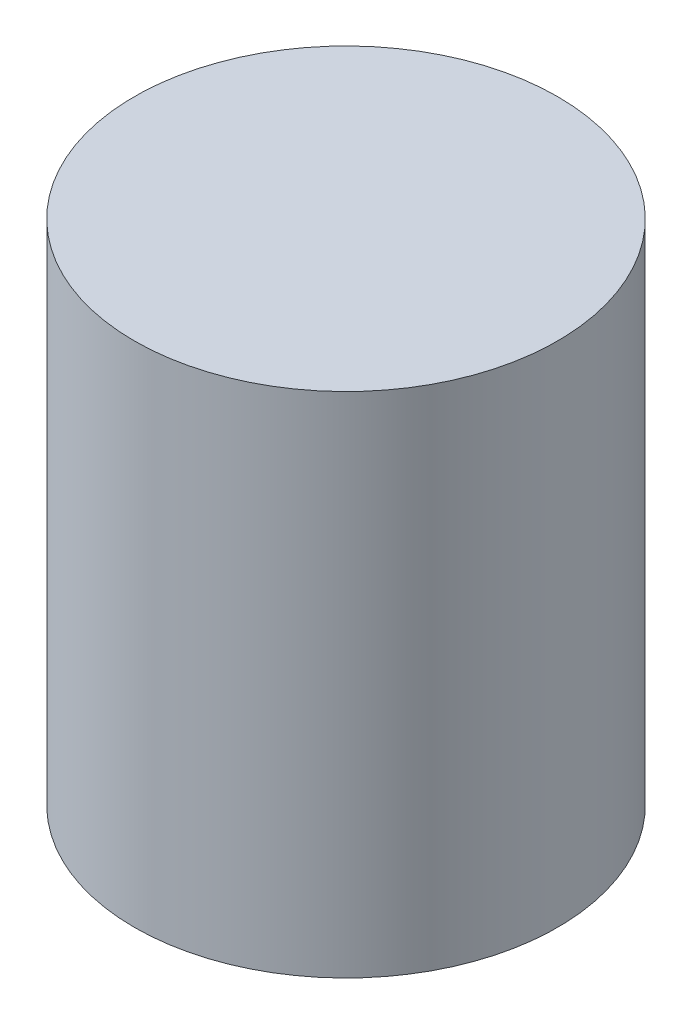
ISO-10303-21;
HEADER;
FILE_DESCRIPTION(('STEP AP214'),'2;1');
FILE_NAME('part.step','',(''),(''),'','','');
FILE_SCHEMA(('AUTOMOTIVE_DESIGN { 1 0 10303 214 1 1 1 1 }'));
ENDSEC;
DATA;
#1=APPLICATION_CONTEXT('core data for automotive mechanical design processes');
#2=APPLICATION_PROTOCOL_DEFINITION('international standard','automotive_design',2000,#1);
#3=PRODUCT_CONTEXT('',#1,'mechanical');
#4=PRODUCT('Part','Part','',(#3));
#5=PRODUCT_RELATED_PRODUCT_CATEGORY('part','',(#4));
#6=PRODUCT_DEFINITION_FORMATION('','',#4);
#7=PRODUCT_DEFINITION_CONTEXT('part definition',#1,'design');
#8=PRODUCT_DEFINITION('design','',#6,#7);
#9=PRODUCT_DEFINITION_SHAPE('','',#8);
#10=(LENGTH_UNIT() NAMED_UNIT(*) SI_UNIT(.MILLI.,.METRE.));
#11=(NAMED_UNIT(*) PLANE_ANGLE_UNIT() SI_UNIT($,.RADIAN.));
#12=(NAMED_UNIT(*) SI_UNIT($,.STERADIAN.) SOLID_ANGLE_UNIT());
#13=UNCERTAINTY_MEASURE_WITH_UNIT(LENGTH_MEASURE(1.E-05),#10,'distance_accuracy_value','');
#14=(GEOMETRIC_REPRESENTATION_CONTEXT(3) GLOBAL_UNCERTAINTY_ASSIGNED_CONTEXT((#13)) GLOBAL_UNIT_ASSIGNED_CONTEXT((#10,
#11,#12)) REPRESENTATION_CONTEXT('',''));
#15=CARTESIAN_POINT('',(0.,0.,0.));
#16=DIRECTION('',(0.,0.,1.));
#17=DIRECTION('',(1.,0.,0.));
#18=AXIS2_PLACEMENT_3D('',#15,#16,#17);
#19=CARTESIAN_POINT('',(0.,60.,0.));
#20=DIRECTION('',(0.,-1.,0.));
#21=DIRECTION('',(0.,0.,-1.));
#22=AXIS2_PLACEMENT_3D('',#19,#20,#21);
#23=CYLINDRICAL_SURFACE('',#22,25.);
#24=CARTESIAN_POINT('',(0.,60.,0.));
#25=DIRECTION('',(0.,1.,0.));
#26=DIRECTION('',(0.,0.,1.));
#27=AXIS2_PLACEMENT_3D('',#24,#25,#26);
#28=CIRCLE('',#27,25.);
#29=CARTESIAN_POINT('',(0.,60.,25.));
#30=VERTEX_POINT('',#29);
#31=EDGE_CURVE('E44',#30,#30,#28,.T.);
#32=ORIENTED_EDGE('',*,*,#31,.F.);
#33=EDGE_LOOP('',(#32));
#34=FACE_BOUND('',#33,.T.);
#35=CARTESIAN_POINT('',(0.,0.,0.));
#36=DIRECTION('',(0.,1.,0.));
#37=DIRECTION('',(0.,0.,1.));
#38=AXIS2_PLACEMENT_3D('',#35,#36,#37);
#39=CIRCLE('',#38,25.);
#40=CARTESIAN_POINT('',(0.,0.,25.));
#41=VERTEX_POINT('',#40);
#42=EDGE_CURVE('E48',#41,#41,#39,.T.);
#43=ORIENTED_EDGE('',*,*,#42,.T.);
#44=EDGE_LOOP('',(#43));
#45=FACE_BOUND('',#44,.T.);
#46=ADVANCED_FACE('F38',(#34,#45),#23,.T.);
#47=CARTESIAN_POINT('',(0.,60.,0.));
#48=DIRECTION('',(0.,1.,0.));
#49=DIRECTION('',(0.,0.,1.));
#50=AXIS2_PLACEMENT_3D('',#47,#48,#49);
#51=PLANE('',#50);
#52=ORIENTED_EDGE('',*,*,#31,.T.);
#53=EDGE_LOOP('',(#52));
#54=FACE_BOUND('',#53,.T.);
#55=ADVANCED_FACE('F75',(#54),#51,.T.);
#56=CARTESIAN_POINT('',(0.,0.,0.));
#57=DIRECTION('',(0.,1.,0.));
#58=DIRECTION('',(0.,0.,1.));
#59=AXIS2_PLACEMENT_3D('',#56,#57,#58);
#60=PLANE('',#59);
#61=ORIENTED_EDGE('',*,*,#42,.F.);
#62=EDGE_LOOP('',(#61));
#63=FACE_BOUND('',#62,.T.);
#64=CARTESIAN_POINT('',(0.,0.,0.));
#65=DIRECTION('',(0.,-1.,0.));
#66=DIRECTION('',(0.,0.,-1.));
#67=AXIS2_PLACEMENT_3D('',#64,#65,#66);
#68=CIRCLE('',#67,15.);
#69=CARTESIAN_POINT('',(0.,0.,-15.));
#70=VERTEX_POINT('',#69);
#71=EDGE_CURVE('E58',#70,#70,#68,.T.);
#72=ORIENTED_EDGE('',*,*,#71,.F.);
#73=EDGE_LOOP('',(#72));
#74=FACE_BOUND('',#73,.T.);
#75=ADVANCED_FACE('F73',(#63,#74),#60,.F.);
#76=CARTESIAN_POINT('',(0.,3.,0.));
#77=DIRECTION('',(0.,-1.,0.));
#78=DIRECTION('',(0.,0.,-1.));
#79=AXIS2_PLACEMENT_3D('',#76,#77,#78);
#80=PLANE('',#79);
#81=CARTESIAN_POINT('',(0.,3.,0.));
#82=DIRECTION('',(0.,-1.,0.));
#83=DIRECTION('',(0.,0.,-1.));
#84=AXIS2_PLACEMENT_3D('',#81,#82,#83);
#85=CIRCLE('',#84,15.);
#86=CARTESIAN_POINT('',(0.,3.,-15.));
#87=VERTEX_POINT('',#86);
#88=EDGE_CURVE('E57',#87,#87,#85,.T.);
#89=ORIENTED_EDGE('',*,*,#88,.T.);
#90=EDGE_LOOP('',(#89));
#91=FACE_BOUND('',#90,.T.);
#92=CARTESIAN_POINT('',(0.,3.,0.));
#93=DIRECTION('',(0.,-1.,0.));
#94=DIRECTION('',(0.,0.,-1.));
#95=AXIS2_PLACEMENT_3D('',#92,#93,#94);
#96=CIRCLE('',#95,22.);
#97=CARTESIAN_POINT('',(0.,3.,-22.));
#98=VERTEX_POINT('',#97);
#99=EDGE_CURVE('E10',#98,#98,#96,.F.);
#100=ORIENTED_EDGE('',*,*,#99,.T.);
#101=EDGE_LOOP('',(#100));
#102=FACE_BOUND('',#101,.T.);
#103=ADVANCED_FACE('F64',(#91,#102),#80,.F.);
#104=CARTESIAN_POINT('',(0.,3.,0.));
#105=DIRECTION('',(0.,-1.,0.));
#106=DIRECTION('',(0.,0.,-1.));
#107=AXIS2_PLACEMENT_3D('',#104,#105,#106);
#108=CYLINDRICAL_SURFACE('',#107,15.);
#109=ORIENTED_EDGE('',*,*,#88,.F.);
#110=EDGE_LOOP('',(#109));
#111=FACE_BOUND('',#110,.T.);
#112=ORIENTED_EDGE('',*,*,#71,.T.);
#113=EDGE_LOOP('',(#112));
#114=FACE_BOUND('',#113,.T.);
#115=ADVANCED_FACE('F66',(#111,#114),#108,.F.);
#116=CARTESIAN_POINT('',(0.,55.,0.));
#117=DIRECTION('',(0.,-1.,0.));
#118=DIRECTION('',(0.,0.,-1.));
#119=AXIS2_PLACEMENT_3D('',#116,#117,#118);
#120=PLANE('',#119);
#121=CARTESIAN_POINT('',(0.,55.,0.));
#122=DIRECTION('',(0.,-1.,0.));
#123=DIRECTION('',(0.,0.,-1.));
#124=AXIS2_PLACEMENT_3D('',#121,#122,#123);
#125=CIRCLE('',#124,22.);
#126=CARTESIAN_POINT('',(0.,55.,-22.));
#127=VERTEX_POINT('',#126);
#128=EDGE_CURVE('E53',#127,#127,#125,.T.);
#129=ORIENTED_EDGE('',*,*,#128,.T.);
#130=EDGE_LOOP('',(#129));
#131=FACE_BOUND('',#130,.T.);
#132=ADVANCED_FACE('F69',(#131),#120,.T.);
#133=CARTESIAN_POINT('',(0.,55.,0.));
#134=DIRECTION('',(0.,-1.,0.));
#135=DIRECTION('',(0.,0.,-1.));
#136=AXIS2_PLACEMENT_3D('',#133,#134,#135);
#137=CYLINDRICAL_SURFACE('',#136,22.);
#138=ORIENTED_EDGE('',*,*,#128,.F.);
#139=EDGE_LOOP('',(#138));
#140=FACE_BOUND('',#139,.T.);
#141=ORIENTED_EDGE('',*,*,#99,.F.);
#142=EDGE_LOOP('',(#141));
#143=FACE_BOUND('',#142,.T.);
#144=ADVANCED_FACE('F101',(#140,#143),#137,.F.);
#145=CLOSED_SHELL('',(#46,#55,#75,#103,#115,#132,#144));
#146=MANIFOLD_SOLID_BREP('B2',#145);
#147=ADVANCED_BREP_SHAPE_REPRESENTATION('',(#18,#146),#14);
#148=SHAPE_DEFINITION_REPRESENTATION(#9,#147);
ENDSEC;
END-ISO-10303-21;
